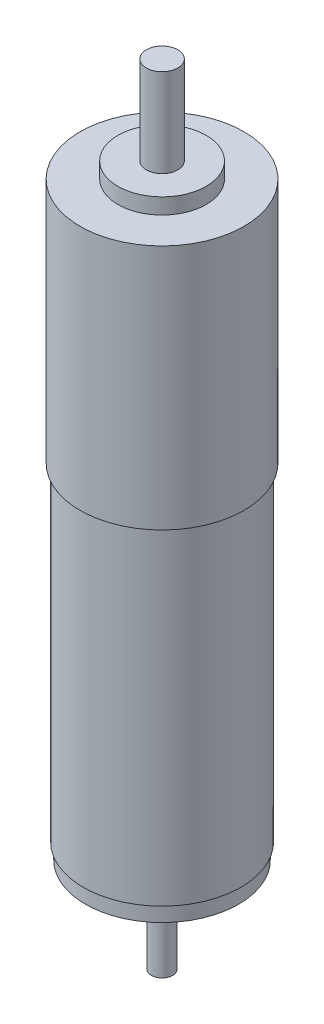
ISO-10303-21;
HEADER;
FILE_DESCRIPTION(('STEP AP214'),'2;1');
FILE_NAME('part.step','',(''),(''),'','','');
FILE_SCHEMA(('AUTOMOTIVE_DESIGN { 1 0 10303 214 1 1 1 1 }'));
ENDSEC;
DATA;
#1=APPLICATION_CONTEXT('core data for automotive mechanical design processes');
#2=APPLICATION_PROTOCOL_DEFINITION('international standard','automotive_design',2000,#1);
#3=PRODUCT_CONTEXT('',#1,'mechanical');
#4=PRODUCT('Part','Part','',(#3));
#5=PRODUCT_RELATED_PRODUCT_CATEGORY('part','',(#4));
#6=PRODUCT_DEFINITION_FORMATION('','',#4);
#7=PRODUCT_DEFINITION_CONTEXT('part definition',#1,'design');
#8=PRODUCT_DEFINITION('design','',#6,#7);
#9=PRODUCT_DEFINITION_SHAPE('','',#8);
#10=(LENGTH_UNIT() NAMED_UNIT(*) SI_UNIT(.MILLI.,.METRE.));
#11=(NAMED_UNIT(*) PLANE_ANGLE_UNIT() SI_UNIT($,.RADIAN.));
#12=(NAMED_UNIT(*) SI_UNIT($,.STERADIAN.) SOLID_ANGLE_UNIT());
#13=UNCERTAINTY_MEASURE_WITH_UNIT(LENGTH_MEASURE(1.E-05),#10,'distance_accuracy_value','');
#14=(GEOMETRIC_REPRESENTATION_CONTEXT(3) GLOBAL_UNCERTAINTY_ASSIGNED_CONTEXT((#13)) GLOBAL_UNIT_ASSIGNED_CONTEXT((#10,
#11,#12)) REPRESENTATION_CONTEXT('',''));
#15=CARTESIAN_POINT('',(0.,0.,0.));
#16=DIRECTION('',(0.,0.,1.));
#17=DIRECTION('',(1.,0.,0.));
#18=AXIS2_PLACEMENT_3D('',#15,#16,#17);
#19=CARTESIAN_POINT('',(0.,0.,0.));
#20=DIRECTION('',(0.,-1.,0.));
#21=DIRECTION('',(0.,0.,-1.));
#22=AXIS2_PLACEMENT_3D('',#19,#20,#21);
#23=PLANE('',#22);
#24=CARTESIAN_POINT('',(0.,0.,0.));
#25=DIRECTION('',(0.,-1.,0.));
#26=DIRECTION('',(0.,0.,-1.));
#27=AXIS2_PLACEMENT_3D('',#24,#25,#26);
#28=CIRCLE('',#27,12.15);
#29=CARTESIAN_POINT('',(0.,0.,-12.15));
#30=VERTEX_POINT('',#29);
#31=EDGE_CURVE('E10',#30,#30,#28,.T.);
#32=ORIENTED_EDGE('',*,*,#31,.T.);
#33=EDGE_LOOP('',(#32));
#34=FACE_BOUND('',#33,.T.);
#35=CARTESIAN_POINT('',(0.,0.,0.));
#36=DIRECTION('',(0.,-1.,0.));
#37=DIRECTION('',(0.,0.,-1.));
#38=AXIS2_PLACEMENT_3D('',#35,#36,#37);
#39=CIRCLE('',#38,4.);
#40=CARTESIAN_POINT('',(0.,0.,-4.));
#41=VERTEX_POINT('',#40);
#42=EDGE_CURVE('E73',#41,#41,#39,.T.);
#43=ORIENTED_EDGE('',*,*,#42,.F.);
#44=EDGE_LOOP('',(#43));
#45=FACE_BOUND('',#44,.T.);
#46=ADVANCED_FACE('F33',(#34,#45),#23,.T.);
#47=CARTESIAN_POINT('',(0.,0.,0.));
#48=DIRECTION('',(0.,-1.,0.));
#49=DIRECTION('',(0.,0.,-1.));
#50=AXIS2_PLACEMENT_3D('',#47,#48,#49);
#51=CYLINDRICAL_SURFACE('',#50,12.15);
#52=CARTESIAN_POINT('',(0.,2.5,0.));
#53=DIRECTION('',(0.,-1.,0.));
#54=DIRECTION('',(0.,0.,-1.));
#55=AXIS2_PLACEMENT_3D('',#52,#53,#54);
#56=CIRCLE('',#55,12.15);
#57=CARTESIAN_POINT('',(0.,2.5,-12.15));
#58=VERTEX_POINT('',#57);
#59=EDGE_CURVE('E40',#58,#58,#56,.T.);
#60=ORIENTED_EDGE('',*,*,#59,.T.);
#61=EDGE_LOOP('',(#60));
#62=FACE_BOUND('',#61,.T.);
#63=ORIENTED_EDGE('',*,*,#31,.F.);
#64=EDGE_LOOP('',(#63));
#65=FACE_BOUND('',#64,.T.);
#66=ADVANCED_FACE('F102',(#62,#65),#51,.T.);
#67=CARTESIAN_POINT('',(12.15,2.5,0.));
#68=DIRECTION('',(0.,-1.,0.));
#69=DIRECTION('',(0.,0.,-1.));
#70=AXIS2_PLACEMENT_3D('',#67,#68,#69);
#71=PLANE('',#70);
#72=CARTESIAN_POINT('',(0.,2.5,0.));
#73=DIRECTION('',(0.,-1.,0.));
#74=DIRECTION('',(0.,0.,-1.));
#75=AXIS2_PLACEMENT_3D('',#72,#73,#74);
#76=CIRCLE('',#75,12.5);
#77=CARTESIAN_POINT('',(0.,2.5,-12.5));
#78=VERTEX_POINT('',#77);
#79=EDGE_CURVE('E44',#78,#78,#76,.T.);
#80=ORIENTED_EDGE('',*,*,#79,.T.);
#81=EDGE_LOOP('',(#80));
#82=FACE_BOUND('',#81,.T.);
#83=ORIENTED_EDGE('',*,*,#59,.F.);
#84=EDGE_LOOP('',(#83));
#85=FACE_BOUND('',#84,.T.);
#86=ADVANCED_FACE('F106',(#82,#85),#71,.T.);
#87=CARTESIAN_POINT('',(0.,0.,0.));
#88=DIRECTION('',(0.,-1.,0.));
#89=DIRECTION('',(0.,0.,-1.));
#90=AXIS2_PLACEMENT_3D('',#87,#88,#89);
#91=CYLINDRICAL_SURFACE('',#90,12.5);
#92=CARTESIAN_POINT('',(0.,54.5,0.));
#93=DIRECTION('',(0.,-1.,0.));
#94=DIRECTION('',(0.,0.,-1.));
#95=AXIS2_PLACEMENT_3D('',#92,#93,#94);
#96=CIRCLE('',#95,12.5);
#97=CARTESIAN_POINT('',(0.,54.5,-12.5));
#98=VERTEX_POINT('',#97);
#99=EDGE_CURVE('E49',#98,#98,#96,.T.);
#100=ORIENTED_EDGE('',*,*,#99,.T.);
#101=EDGE_LOOP('',(#100));
#102=FACE_BOUND('',#101,.T.);
#103=ORIENTED_EDGE('',*,*,#79,.F.);
#104=EDGE_LOOP('',(#103));
#105=FACE_BOUND('',#104,.T.);
#106=ADVANCED_FACE('F114',(#102,#105),#91,.T.);
#107=CARTESIAN_POINT('',(12.5,54.5,0.));
#108=DIRECTION('',(0.,-1.,0.));
#109=DIRECTION('',(0.,0.,-1.));
#110=AXIS2_PLACEMENT_3D('',#107,#108,#109);
#111=PLANE('',#110);
#112=CARTESIAN_POINT('',(0.,54.5,0.));
#113=DIRECTION('',(0.,-1.,0.));
#114=DIRECTION('',(0.,0.,-1.));
#115=AXIS2_PLACEMENT_3D('',#112,#113,#114);
#116=CIRCLE('',#115,13.);
#117=CARTESIAN_POINT('',(0.,54.5,-13.));
#118=VERTEX_POINT('',#117);
#119=EDGE_CURVE('E52',#118,#118,#116,.T.);
#120=ORIENTED_EDGE('',*,*,#119,.T.);
#121=EDGE_LOOP('',(#120));
#122=FACE_BOUND('',#121,.T.);
#123=ORIENTED_EDGE('',*,*,#99,.F.);
#124=EDGE_LOOP('',(#123));
#125=FACE_BOUND('',#124,.T.);
#126=ADVANCED_FACE('F121',(#122,#125),#111,.T.);
#127=CARTESIAN_POINT('',(0.,0.,0.));
#128=DIRECTION('',(0.,-1.,0.));
#129=DIRECTION('',(0.,0.,-1.));
#130=AXIS2_PLACEMENT_3D('',#127,#128,#129);
#131=CYLINDRICAL_SURFACE('',#130,13.);
#132=CARTESIAN_POINT('',(0.,93.5,0.));
#133=DIRECTION('',(0.,-1.,0.));
#134=DIRECTION('',(0.,0.,-1.));
#135=AXIS2_PLACEMENT_3D('',#132,#133,#134);
#136=CIRCLE('',#135,13.);
#137=CARTESIAN_POINT('',(0.,93.5,-13.));
#138=VERTEX_POINT('',#137);
#139=EDGE_CURVE('E55',#138,#138,#136,.T.);
#140=ORIENTED_EDGE('',*,*,#139,.T.);
#141=EDGE_LOOP('',(#140));
#142=FACE_BOUND('',#141,.T.);
#143=ORIENTED_EDGE('',*,*,#119,.F.);
#144=EDGE_LOOP('',(#143));
#145=FACE_BOUND('',#144,.T.);
#146=ADVANCED_FACE('F125',(#142,#145),#131,.T.);
#147=CARTESIAN_POINT('',(13.,93.5,0.));
#148=DIRECTION('',(0.,1.,0.));
#149=DIRECTION('',(0.,0.,1.));
#150=AXIS2_PLACEMENT_3D('',#147,#148,#149);
#151=PLANE('',#150);
#152=CARTESIAN_POINT('',(0.,93.5,0.));
#153=DIRECTION('',(0.,-1.,0.));
#154=DIRECTION('',(0.,0.,-1.));
#155=AXIS2_PLACEMENT_3D('',#152,#153,#154);
#156=CIRCLE('',#155,7.);
#157=CARTESIAN_POINT('',(0.,93.5,-7.));
#158=VERTEX_POINT('',#157);
#159=EDGE_CURVE('E58',#158,#158,#156,.T.);
#160=ORIENTED_EDGE('',*,*,#159,.T.);
#161=EDGE_LOOP('',(#160));
#162=FACE_BOUND('',#161,.T.);
#163=ORIENTED_EDGE('',*,*,#139,.F.);
#164=EDGE_LOOP('',(#163));
#165=FACE_BOUND('',#164,.T.);
#166=ADVANCED_FACE('F129',(#162,#165),#151,.T.);
#167=CARTESIAN_POINT('',(0.,0.,0.));
#168=DIRECTION('',(0.,-1.,0.));
#169=DIRECTION('',(0.,0.,-1.));
#170=AXIS2_PLACEMENT_3D('',#167,#168,#169);
#171=CYLINDRICAL_SURFACE('',#170,7.);
#172=CARTESIAN_POINT('',(0.,96.,0.));
#173=DIRECTION('',(0.,-1.,0.));
#174=DIRECTION('',(0.,0.,-1.));
#175=AXIS2_PLACEMENT_3D('',#172,#173,#174);
#176=CIRCLE('',#175,7.);
#177=CARTESIAN_POINT('',(0.,96.,-7.));
#178=VERTEX_POINT('',#177);
#179=EDGE_CURVE('E61',#178,#178,#176,.T.);
#180=ORIENTED_EDGE('',*,*,#179,.T.);
#181=EDGE_LOOP('',(#180));
#182=FACE_BOUND('',#181,.T.);
#183=ORIENTED_EDGE('',*,*,#159,.F.);
#184=EDGE_LOOP('',(#183));
#185=FACE_BOUND('',#184,.T.);
#186=ADVANCED_FACE('F133',(#182,#185),#171,.T.);
#187=CARTESIAN_POINT('',(7.,96.,0.));
#188=DIRECTION('',(0.,1.,0.));
#189=DIRECTION('',(0.,0.,1.));
#190=AXIS2_PLACEMENT_3D('',#187,#188,#189);
#191=PLANE('',#190);
#192=CARTESIAN_POINT('',(0.,96.,0.));
#193=DIRECTION('',(0.,-1.,0.));
#194=DIRECTION('',(0.,0.,-1.));
#195=AXIS2_PLACEMENT_3D('',#192,#193,#194);
#196=CIRCLE('',#195,2.5);
#197=CARTESIAN_POINT('',(0.,96.,-2.5));
#198=VERTEX_POINT('',#197);
#199=EDGE_CURVE('E64',#198,#198,#196,.T.);
#200=ORIENTED_EDGE('',*,*,#199,.T.);
#201=EDGE_LOOP('',(#200));
#202=FACE_BOUND('',#201,.T.);
#203=ORIENTED_EDGE('',*,*,#179,.F.);
#204=EDGE_LOOP('',(#203));
#205=FACE_BOUND('',#204,.T.);
#206=ADVANCED_FACE('F137',(#202,#205),#191,.T.);
#207=CARTESIAN_POINT('',(0.,0.,0.));
#208=DIRECTION('',(0.,-1.,0.));
#209=DIRECTION('',(0.,0.,-1.));
#210=AXIS2_PLACEMENT_3D('',#207,#208,#209);
#211=CYLINDRICAL_SURFACE('',#210,2.5);
#212=CARTESIAN_POINT('',(0.,110.,0.));
#213=DIRECTION('',(0.,-1.,0.));
#214=DIRECTION('',(0.,0.,-1.));
#215=AXIS2_PLACEMENT_3D('',#212,#213,#214);
#216=CIRCLE('',#215,2.5);
#217=CARTESIAN_POINT('',(0.,110.,-2.5));
#218=VERTEX_POINT('',#217);
#219=EDGE_CURVE('E67',#218,#218,#216,.T.);
#220=ORIENTED_EDGE('',*,*,#219,.T.);
#221=EDGE_LOOP('',(#220));
#222=FACE_BOUND('',#221,.T.);
#223=ORIENTED_EDGE('',*,*,#199,.F.);
#224=EDGE_LOOP('',(#223));
#225=FACE_BOUND('',#224,.T.);
#226=ADVANCED_FACE('F98',(#222,#225),#211,.T.);
#227=CARTESIAN_POINT('',(2.5,110.,0.));
#228=DIRECTION('',(0.,1.,0.));
#229=DIRECTION('',(0.,0.,1.));
#230=AXIS2_PLACEMENT_3D('',#227,#228,#229);
#231=PLANE('',#230);
#232=ORIENTED_EDGE('',*,*,#219,.F.);
#233=EDGE_LOOP('',(#232));
#234=FACE_BOUND('',#233,.T.);
#235=ADVANCED_FACE('F89',(#234),#231,.T.);
#236=CARTESIAN_POINT('',(0.,-2.5,0.));
#237=DIRECTION('',(0.,-1.,0.));
#238=DIRECTION('',(0.,0.,-1.));
#239=AXIS2_PLACEMENT_3D('',#236,#237,#238);
#240=PLANE('',#239);
#241=CARTESIAN_POINT('',(0.,-2.5,0.));
#242=DIRECTION('',(0.,-1.,0.));
#243=DIRECTION('',(0.,0.,-1.));
#244=AXIS2_PLACEMENT_3D('',#241,#242,#243);
#245=CIRCLE('',#244,4.);
#246=CARTESIAN_POINT('',(0.,-2.5,-4.));
#247=VERTEX_POINT('',#246);
#248=EDGE_CURVE('E76',#247,#247,#245,.T.);
#249=ORIENTED_EDGE('',*,*,#248,.T.);
#250=EDGE_LOOP('',(#249));
#251=FACE_BOUND('',#250,.T.);
#252=CARTESIAN_POINT('',(0.,-2.5,0.));
#253=DIRECTION('',(0.,-1.,0.));
#254=DIRECTION('',(0.,0.,-1.));
#255=AXIS2_PLACEMENT_3D('',#252,#253,#254);
#256=CIRCLE('',#255,1.69275807705358);
#257=CARTESIAN_POINT('',(0.,-2.5,-1.69275807705358));
#258=VERTEX_POINT('',#257);
#259=EDGE_CURVE('E36',#258,#258,#256,.T.);
#260=ORIENTED_EDGE('',*,*,#259,.F.);
#261=EDGE_LOOP('',(#260));
#262=FACE_BOUND('',#261,.T.);
#263=ADVANCED_FACE('F86',(#251,#262),#240,.T.);
#264=CARTESIAN_POINT('',(0.,-2.5,0.));
#265=DIRECTION('',(0.,1.,0.));
#266=DIRECTION('',(0.,0.,1.));
#267=AXIS2_PLACEMENT_3D('',#264,#265,#266);
#268=CYLINDRICAL_SURFACE('',#267,4.);
#269=ORIENTED_EDGE('',*,*,#248,.F.);
#270=EDGE_LOOP('',(#269));
#271=FACE_BOUND('',#270,.T.);
#272=ORIENTED_EDGE('',*,*,#42,.T.);
#273=EDGE_LOOP('',(#272));
#274=FACE_BOUND('',#273,.T.);
#275=ADVANCED_FACE('F88',(#271,#274),#268,.T.);
#276=CARTESIAN_POINT('',(0.,-15.,0.));
#277=DIRECTION('',(0.,-1.,0.));
#278=DIRECTION('',(0.,0.,-1.));
#279=AXIS2_PLACEMENT_3D('',#276,#277,#278);
#280=PLANE('',#279);
#281=CARTESIAN_POINT('',(0.,-15.,0.));
#282=DIRECTION('',(0.,-1.,0.));
#283=DIRECTION('',(0.,0.,-1.));
#284=AXIS2_PLACEMENT_3D('',#281,#282,#283);
#285=CIRCLE('',#284,1.69275807705358);
#286=CARTESIAN_POINT('',(0.,-15.,-1.69275807705358));
#287=VERTEX_POINT('',#286);
#288=EDGE_CURVE('E70',#287,#287,#285,.T.);
#289=ORIENTED_EDGE('',*,*,#288,.T.);
#290=EDGE_LOOP('',(#289));
#291=FACE_BOUND('',#290,.T.);
#292=ADVANCED_FACE('F95',(#291),#280,.T.);
#293=CARTESIAN_POINT('',(0.,-15.,0.));
#294=DIRECTION('',(0.,1.,0.));
#295=DIRECTION('',(0.,0.,1.));
#296=AXIS2_PLACEMENT_3D('',#293,#294,#295);
#297=CYLINDRICAL_SURFACE('',#296,1.69275807705358);
#298=ORIENTED_EDGE('',*,*,#259,.T.);
#299=EDGE_LOOP('',(#298));
#300=FACE_BOUND('',#299,.T.);
#301=ORIENTED_EDGE('',*,*,#288,.F.);
#302=EDGE_LOOP('',(#301));
#303=FACE_BOUND('',#302,.T.);
#304=ADVANCED_FACE('F83',(#300,#303),#297,.T.);
#305=CLOSED_SHELL('',(#46,#66,#86,#106,#126,#146,#166,#186,#206,#226,#235,#263,#275,#292,#304));
#306=MANIFOLD_SOLID_BREP('B2',#305);
#307=ADVANCED_BREP_SHAPE_REPRESENTATION('',(#18,#306),#14);
#308=SHAPE_DEFINITION_REPRESENTATION(#9,#307);
ENDSEC;
END-ISO-10303-21;
